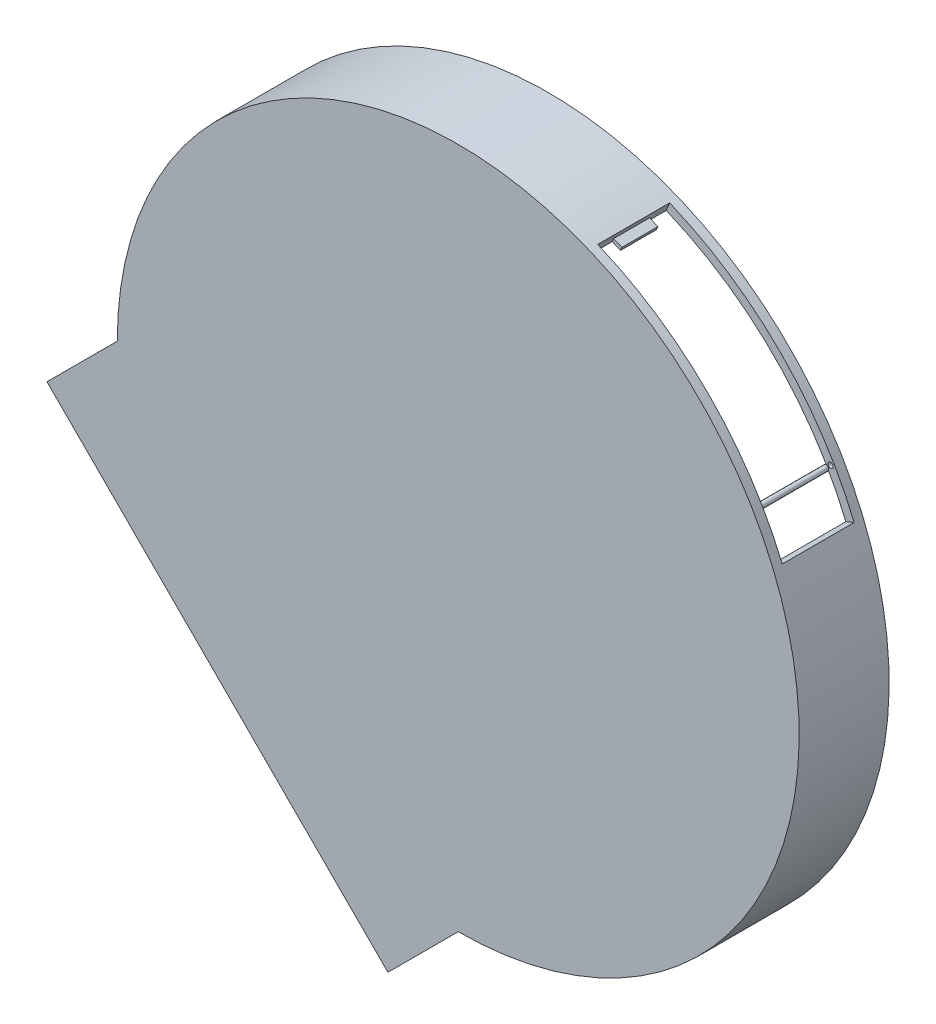
ISO-10303-21;
HEADER;
FILE_DESCRIPTION(('STEP AP214'),'2;1');
FILE_NAME('part.step','',(''),(''),'','','');
FILE_SCHEMA(('AUTOMOTIVE_DESIGN { 1 0 10303 214 1 1 1 1 }'));
ENDSEC;
DATA;
#1=APPLICATION_CONTEXT('core data for automotive mechanical design processes');
#2=APPLICATION_PROTOCOL_DEFINITION('international standard','automotive_design',2000,#1);
#3=PRODUCT_CONTEXT('',#1,'mechanical');
#4=PRODUCT('Part','Part','',(#3));
#5=PRODUCT_RELATED_PRODUCT_CATEGORY('part','',(#4));
#6=PRODUCT_DEFINITION_FORMATION('','',#4);
#7=PRODUCT_DEFINITION_CONTEXT('part definition',#1,'design');
#8=PRODUCT_DEFINITION('design','',#6,#7);
#9=PRODUCT_DEFINITION_SHAPE('','',#8);
#10=(LENGTH_UNIT() NAMED_UNIT(*) SI_UNIT(.MILLI.,.METRE.));
#11=(NAMED_UNIT(*) PLANE_ANGLE_UNIT() SI_UNIT($,.RADIAN.));
#12=(NAMED_UNIT(*) SI_UNIT($,.STERADIAN.) SOLID_ANGLE_UNIT());
#13=UNCERTAINTY_MEASURE_WITH_UNIT(LENGTH_MEASURE(1.E-05),#10,'distance_accuracy_value','');
#14=(GEOMETRIC_REPRESENTATION_CONTEXT(3) GLOBAL_UNCERTAINTY_ASSIGNED_CONTEXT((#13)) GLOBAL_UNIT_ASSIGNED_CONTEXT((#10,
#11,#12)) REPRESENTATION_CONTEXT('',''));
#15=CARTESIAN_POINT('',(0.,0.,0.));
#16=DIRECTION('',(0.,0.,1.));
#17=DIRECTION('',(1.,0.,0.));
#18=AXIS2_PLACEMENT_3D('',#15,#16,#17);
#19=CARTESIAN_POINT('',(0.,0.,10.));
#20=DIRECTION('',(0.923879532511282,-0.382683432365102,0.));
#21=DIRECTION('',(0.382683432365102,0.923879532511282,0.));
#22=AXIS2_PLACEMENT_3D('',#19,#20,#21);
#23=PLANE('',#22);
#24=DIRECTION('',(0.,0.,-1.));
#25=VECTOR('',#24,1.);
#26=CARTESIAN_POINT('',(142.740920272183,344.607065626708,0.));
#27=LINE('',#26,#25);
#28=CARTESIAN_POINT('',(142.740920272183,344.607065626708,70.));
#29=VERTEX_POINT('',#28);
#30=CARTESIAN_POINT('',(142.740920272183,344.607065626708,30.));
#31=VERTEX_POINT('',#30);
#32=EDGE_CURVE('E63',#29,#31,#27,.T.);
#33=ORIENTED_EDGE('',*,*,#32,.T.);
#34=DIRECTION('',(0.382683432365102,0.923879532511282,0.));
#35=VECTOR('',#34,1.);
#36=CARTESIAN_POINT('',(0.,0.,30.));
#37=LINE('',#36,#35);
#38=CARTESIAN_POINT('',(141.210186542723,340.911547496663,30.));
#39=VERTEX_POINT('',#38);
#40=EDGE_CURVE('E520',#39,#31,#37,.T.);
#41=ORIENTED_EDGE('',*,*,#40,.F.);
#42=DIRECTION('',(0.,0.,-1.));
#43=VECTOR('',#42,1.);
#44=CARTESIAN_POINT('',(141.210186542723,340.911547496663,100.));
#45=LINE('',#44,#43);
#46=CARTESIAN_POINT('',(141.210186542723,340.911547496663,10.));
#47=VERTEX_POINT('',#46);
#48=EDGE_CURVE('E304',#47,#39,#45,.F.);
#49=ORIENTED_EDGE('',*,*,#48,.F.);
#50=DIRECTION('',(0.382683432365102,0.923879532511282,0.));
#51=VECTOR('',#50,1.);
#52=CARTESIAN_POINT('',(0.,0.,10.));
#53=LINE('',#52,#51);
#54=CARTESIAN_POINT('',(145.037020866374,350.150342821776,10.));
#55=VERTEX_POINT('',#54);
#56=EDGE_CURVE('E272',#47,#55,#53,.T.);
#57=ORIENTED_EDGE('',*,*,#56,.T.);
#58=DIRECTION('',(0.,0.,1.));
#59=VECTOR('',#58,1.);
#60=CARTESIAN_POINT('',(145.037020866374,350.150342821776,10.));
#61=LINE('',#60,#59);
#62=CARTESIAN_POINT('',(145.037020866374,350.150342821776,90.));
#63=VERTEX_POINT('',#62);
#64=EDGE_CURVE('E296',#55,#63,#61,.T.);
#65=ORIENTED_EDGE('',*,*,#64,.T.);
#66=DIRECTION('',(0.382683432365102,0.923879532511282,0.));
#67=VECTOR('',#66,1.);
#68=CARTESIAN_POINT('',(0.,0.,90.));
#69=LINE('',#68,#67);
#70=CARTESIAN_POINT('',(141.210186542723,340.911547496663,90.));
#71=VERTEX_POINT('',#70);
#72=EDGE_CURVE('E271',#71,#63,#69,.T.);
#73=ORIENTED_EDGE('',*,*,#72,.F.);
#74=CARTESIAN_POINT('',(141.210186542723,340.911547496663,70.));
#75=VERTEX_POINT('',#74);
#76=EDGE_CURVE('E303',#75,#71,#45,.F.);
#77=ORIENTED_EDGE('',*,*,#76,.F.);
#78=DIRECTION('',(0.382683432365102,0.923879532511282,0.));
#79=VECTOR('',#78,1.);
#80=CARTESIAN_POINT('',(0.,0.,70.));
#81=LINE('',#80,#79);
#82=EDGE_CURVE('E68',#75,#29,#81,.T.);
#83=ORIENTED_EDGE('',*,*,#82,.T.);
#84=EDGE_LOOP('',(#33,#41,#49,#57,#65,#73,#77,#83));
#85=FACE_BOUND('',#84,.T.);
#86=ADVANCED_FACE('F47',(#85),#23,.T.);
#87=CARTESIAN_POINT('',(-403.050865276332,24.0508652763321,0.));
#88=DIRECTION('',(0.474460773156863,0.474460773156863,0.741467429811171));
#89=DIRECTION('',(0.,-0.842311826158308,0.538990526367446));
#90=AXIS2_PLACEMENT_3D('',#87,#88,#89);
#91=PLANE('',#90);
#92=DIRECTION('',(-0.707106781186548,0.707106781186547,0.));
#93=VECTOR('',#92,1.);
#94=CARTESIAN_POINT('',(-189.5,-189.5,0.));
#95=LINE('',#94,#93);
#96=CARTESIAN_POINT('',(1.11022302462516E-13,-379.,0.));
#97=VERTEX_POINT('',#96);
#98=CARTESIAN_POINT('',(-379.,0.,0.));
#99=VERTEX_POINT('',#98);
#100=EDGE_CURVE('E56',#97,#99,#95,.T.);
#101=ORIENTED_EDGE('',*,*,#100,.F.);
#102=DIRECTION('',(-0.524296647648439,-0.524296647648439,0.67098886021246));
#103=VECTOR('',#102,1.);
#104=CARTESIAN_POINT('',(1.11022302462516E-13,-379.,0.));
#105=LINE('',#104,#103);
#106=CARTESIAN_POINT('',(-78.1379064150821,-457.137906415082,100.));
#107=VERTEX_POINT('',#106);
#108=EDGE_CURVE('E348',#97,#107,#105,.T.);
#109=ORIENTED_EDGE('',*,*,#108,.T.);
#110=DIRECTION('',(-0.707106781186548,0.707106781186548,0.));
#111=VECTOR('',#110,1.);
#112=CARTESIAN_POINT('',(-267.637906415082,-267.637906415082,100.));
#113=LINE('',#112,#111);
#114=CARTESIAN_POINT('',(-457.137906415082,-78.1379064150823,100.));
#115=VERTEX_POINT('',#114);
#116=EDGE_CURVE('E369',#107,#115,#113,.T.);
#117=ORIENTED_EDGE('',*,*,#116,.T.);
#118=DIRECTION('',(-0.524296647648439,-0.524296647648439,0.670988860212461));
#119=VECTOR('',#118,1.);
#120=CARTESIAN_POINT('',(-309.997557577171,69.0024424228294,-88.3085375442188));
#121=LINE('',#120,#119);
#122=EDGE_CURVE('E356',#99,#115,#121,.T.);
#123=ORIENTED_EDGE('',*,*,#122,.F.);
#124=EDGE_LOOP('',(#101,#109,#117,#123));
#125=FACE_BOUND('',#124,.T.);
#126=DIRECTION('',(-0.707106781186547,0.707106781186548,0.));
#127=VECTOR('',#126,1.);
#128=CARTESIAN_POINT('',(-220.957798858906,-220.957798858906,40.2593316127476));
#129=LINE('',#128,#127);
#130=CARTESIAN_POINT('',(-181.888845651365,-260.026752066448,40.2593316127477));
#131=VERTEX_POINT('',#130);
#132=CARTESIAN_POINT('',(-260.026752066447,-181.888845651365,40.2593316127476));
#133=VERTEX_POINT('',#132);
#134=EDGE_CURVE('E206',#131,#133,#129,.T.);
#135=ORIENTED_EDGE('',*,*,#134,.T.);
#136=DIRECTION('',(0.52429664764844,0.524296647648439,-0.670988860212461));
#137=VECTOR('',#136,1.);
#138=CARTESIAN_POINT('',(-124.386789782827,-46.2488833677458,-133.33114259714));
#139=LINE('',#138,#137);
#140=CARTESIAN_POINT('',(-291.484550925353,-213.346644510272,80.5186632254952));
#141=VERTEX_POINT('',#140);
#142=EDGE_CURVE('E221',#141,#133,#139,.T.);
#143=ORIENTED_EDGE('',*,*,#142,.F.);
#144=DIRECTION('',(-0.707106781186547,0.707106781186548,0.));
#145=VECTOR('',#144,1.);
#146=CARTESIAN_POINT('',(-252.415597717813,-252.415597717812,80.5186632254952));
#147=LINE('',#146,#145);
#148=CARTESIAN_POINT('',(-213.346644510271,-291.484550925354,80.5186632254953));
#149=VERTEX_POINT('',#148);
#150=EDGE_CURVE('E236',#149,#141,#147,.T.);
#151=ORIENTED_EDGE('',*,*,#150,.F.);
#152=DIRECTION('',(0.52429664764844,0.524296647648438,-0.670988860212461));
#153=VECTOR('',#152,1.);
#154=CARTESIAN_POINT('',(-46.2488833677451,-124.386789782828,-133.33114259714));
#155=LINE('',#154,#153);
#156=EDGE_CURVE('E211',#149,#131,#155,.T.);
#157=ORIENTED_EDGE('',*,*,#156,.T.);
#158=EDGE_LOOP('',(#135,#143,#151,#157));
#159=FACE_BOUND('',#158,.T.);
#160=ADVANCED_FACE('F403',(#125,#159),#91,.F.);
#161=CARTESIAN_POINT('',(-398.306257544763,28.7954730079007,7.4146742981117));
#162=DIRECTION('',(0.474460773156863,0.474460773156863,0.741467429811171));
#163=DIRECTION('',(0.,-0.842311826158308,0.538990526367446));
#164=AXIS2_PLACEMENT_3D('',#161,#162,#163);
#165=PLANE('',#164);
#166=DIRECTION('',(-0.707106781186548,0.707106781186547,0.));
#167=VECTOR('',#166,1.);
#168=CARTESIAN_POINT('',(-178.96172100439,-178.96172100439,0.));
#169=LINE('',#168,#167);
#170=CARTESIAN_POINT('',(10.9150875193134,-368.838529528093,0.));
#171=VERTEX_POINT('',#170);
#172=CARTESIAN_POINT('',(-368.838529528093,10.9150875193133,0.));
#173=VERTEX_POINT('',#172);
#174=EDGE_CURVE('E313',#171,#173,#169,.T.);
#175=ORIENTED_EDGE('',*,*,#174,.T.);
#176=CARTESIAN_POINT('',(0.,0.,-229.033166122616));
#177=DIRECTION('',(0.474460773156863,0.474460773156863,0.741467429811171));
#178=DIRECTION('',(0.524296647648439,0.524296647648439,-0.670988860212461));
#179=AXIS2_PLACEMENT_3D('',#176,#177,#178);
#180=ELLIPSE('',#179,497.661778743233,369.);
#181=CARTESIAN_POINT('',(-368.977008299085,-4.11914392281612,9.70893060054728));
#182=VERTEX_POINT('',#181);
#183=EDGE_CURVE('E341',#182,#173,#180,.F.);
#184=ORIENTED_EDGE('',*,*,#183,.F.);
#185=DIRECTION('',(-0.524296647648439,-0.524296647648439,0.670988860212461));
#186=VECTOR('',#185,1.);
#187=CARTESIAN_POINT('',(-298.181882033737,66.6759823425325,-80.8938632461071));
#188=LINE('',#187,#186);
#189=CARTESIAN_POINT('',(-431.714768966098,-66.8569045898292,90.));
#190=VERTEX_POINT('',#189);
#191=EDGE_CURVE('E325',#182,#190,#188,.T.);
#192=ORIENTED_EDGE('',*,*,#191,.T.);
#193=DIRECTION('',(-0.707106781186548,0.707106781186547,0.));
#194=VECTOR('',#193,1.);
#195=CARTESIAN_POINT('',(-249.285836777964,-249.285836777964,90.));
#196=LINE('',#195,#194);
#197=CARTESIAN_POINT('',(-66.8569045898291,-431.714768966098,90.));
#198=VERTEX_POINT('',#197);
#199=EDGE_CURVE('E333',#198,#190,#196,.T.);
#200=ORIENTED_EDGE('',*,*,#199,.F.);
#201=DIRECTION('',(-0.524296647648439,-0.524296647648439,0.670988860212461));
#202=VECTOR('',#201,1.);
#203=CARTESIAN_POINT('',(66.6759823425325,-298.181882033737,-80.893863246107));
#204=LINE('',#203,#202);
#205=CARTESIAN_POINT('',(-4.11914392281601,-368.977008299085,9.70893060054731));
#206=VERTEX_POINT('',#205);
#207=EDGE_CURVE('E308',#206,#198,#204,.T.);
#208=ORIENTED_EDGE('',*,*,#207,.F.);
#209=CARTESIAN_POINT('',(0.,0.,-229.033166122616));
#210=DIRECTION('',(0.474460773156863,0.474460773156863,0.741467429811171));
#211=DIRECTION('',(0.524296647648439,0.524296647648439,-0.670988860212461));
#212=AXIS2_PLACEMENT_3D('',#209,#210,#211);
#213=ELLIPSE('',#212,497.661778743233,369.);
#214=EDGE_CURVE('E345',#206,#171,#213,.T.);
#215=ORIENTED_EDGE('',*,*,#214,.T.);
#216=EDGE_LOOP('',(#175,#184,#192,#200,#208,#215));
#217=FACE_BOUND('',#216,.T.);
#218=DIRECTION('',(0.52429664764844,0.524296647648439,-0.670988860212461));
#219=VECTOR('',#218,1.);
#220=CARTESIAN_POINT('',(-119.642182051259,-41.5042756361771,-125.916468299029));
#221=LINE('',#220,#219);
#222=CARTESIAN_POINT('',(-286.739943193785,-208.602036778703,87.9333375236069));
#223=VERTEX_POINT('',#222);
#224=CARTESIAN_POINT('',(-255.282144334878,-177.144237919797,47.6740059108593));
#225=VERTEX_POINT('',#224);
#226=EDGE_CURVE('E228',#223,#225,#221,.T.);
#227=ORIENTED_EDGE('',*,*,#226,.T.);
#228=DIRECTION('',(-0.707106781186547,0.707106781186548,0.));
#229=VECTOR('',#228,1.);
#230=CARTESIAN_POINT('',(-216.213191127338,-216.213191127337,47.6740059108593));
#231=LINE('',#230,#229);
#232=CARTESIAN_POINT('',(-177.144237919796,-255.282144334879,47.6740059108594));
#233=VERTEX_POINT('',#232);
#234=EDGE_CURVE('E217',#233,#225,#231,.T.);
#235=ORIENTED_EDGE('',*,*,#234,.F.);
#236=DIRECTION('',(0.52429664764844,0.524296647648438,-0.670988860212461));
#237=VECTOR('',#236,1.);
#238=CARTESIAN_POINT('',(-41.5042756361765,-119.642182051259,-125.916468299029));
#239=LINE('',#238,#237);
#240=CARTESIAN_POINT('',(-208.602036778703,-286.739943193785,87.933337523607));
#241=VERTEX_POINT('',#240);
#242=EDGE_CURVE('E220',#241,#233,#239,.T.);
#243=ORIENTED_EDGE('',*,*,#242,.F.);
#244=DIRECTION('',(-0.707106781186547,0.707106781186548,0.));
#245=VECTOR('',#244,1.);
#246=CARTESIAN_POINT('',(-247.670989986244,-247.670989986244,87.9333375236069));
#247=LINE('',#246,#245);
#248=EDGE_CURVE('E224',#241,#223,#247,.T.);
#249=ORIENTED_EDGE('',*,*,#248,.T.);
#250=EDGE_LOOP('',(#227,#235,#243,#249));
#251=FACE_BOUND('',#250,.T.);
#252=ADVANCED_FACE('F423',(#217,#251),#165,.T.);
#253=CARTESIAN_POINT('',(323.893501015378,187.000000000004,95.));
#254=DIRECTION('',(0.,0.,-1.));
#255=DIRECTION('',(-1.,0.,0.));
#256=AXIS2_PLACEMENT_3D('',#253,#254,#255);
#257=CYLINDRICAL_SURFACE('',#256,2.99999999999999);
#258=CARTESIAN_POINT('',(323.893501015378,187.000000000004,90.));
#259=DIRECTION('',(0.,0.,1.));
#260=DIRECTION('',(1.,0.,0.));
#261=AXIS2_PLACEMENT_3D('',#258,#259,#260);
#262=CIRCLE('',#261,2.99999999999999);
#263=CARTESIAN_POINT('',(326.893501015378,187.000000000004,90.));
#264=VERTEX_POINT('',#263);
#265=EDGE_CURVE('E267',#264,#264,#262,.T.);
#266=ORIENTED_EDGE('',*,*,#265,.F.);
#267=EDGE_LOOP('',(#266));
#268=FACE_BOUND('',#267,.T.);
#269=CARTESIAN_POINT('',(323.89350101538,187.,15.));
#270=DIRECTION('',(0.,0.,-1.));
#271=DIRECTION('',(-1.,0.,0.));
#272=AXIS2_PLACEMENT_3D('',#269,#270,#271);
#273=CIRCLE('',#272,2.99999999999999);
#274=CARTESIAN_POINT('',(320.89350101538,187.,15.));
#275=VERTEX_POINT('',#274);
#276=EDGE_CURVE('E256',#275,#275,#273,.T.);
#277=ORIENTED_EDGE('',*,*,#276,.F.);
#278=EDGE_LOOP('',(#277));
#279=FACE_BOUND('',#278,.T.);
#280=ADVANCED_FACE('F444',(#268,#279),#257,.T.);
#281=CARTESIAN_POINT('',(0.,0.,100.));
#282=DIRECTION('',(0.,0.,-1.));
#283=DIRECTION('',(-1.,0.,0.));
#284=AXIS2_PLACEMENT_3D('',#281,#282,#283);
#285=CYLINDRICAL_SURFACE('',#284,379.);
#286=CARTESIAN_POINT('',(0.,0.,0.));
#287=DIRECTION('',(0.,0.,1.));
#288=DIRECTION('',(1.,0.,0.));
#289=AXIS2_PLACEMENT_3D('',#286,#287,#288);
#290=CIRCLE('',#289,379.);
#291=EDGE_CURVE('E360',#97,#99,#290,.T.);
#292=ORIENTED_EDGE('',*,*,#291,.T.);
#293=DIRECTION('',(0.,0.,-1.));
#294=VECTOR('',#293,1.);
#295=CARTESIAN_POINT('',(-379.,0.,100.));
#296=LINE('',#295,#294);
#297=CARTESIAN_POINT('',(-379.,0.,100.));
#298=VERTEX_POINT('',#297);
#299=EDGE_CURVE('E383',#298,#99,#296,.T.);
#300=ORIENTED_EDGE('',*,*,#299,.F.);
#301=CARTESIAN_POINT('',(0.,0.,100.));
#302=DIRECTION('',(0.,0.,1.));
#303=DIRECTION('',(1.,0.,0.));
#304=AXIS2_PLACEMENT_3D('',#301,#302,#303);
#305=CIRCLE('',#304,379.);
#306=CARTESIAN_POINT('',(0.,-379.,100.));
#307=VERTEX_POINT('',#306);
#308=EDGE_CURVE('E361',#307,#298,#305,.T.);
#309=ORIENTED_EDGE('',*,*,#308,.F.);
#310=DIRECTION('',(0.,0.,-1.));
#311=VECTOR('',#310,1.);
#312=CARTESIAN_POINT('',(0.,-379.,100.));
#313=LINE('',#312,#311);
#314=EDGE_CURVE('E376',#307,#97,#313,.T.);
#315=ORIENTED_EDGE('',*,*,#314,.T.);
#316=EDGE_LOOP('',(#292,#300,#309,#315));
#317=FACE_BOUND('',#316,.T.);
#318=CARTESIAN_POINT('',(0.,0.,10.));
#319=DIRECTION('',(0.,0.,-1.));
#320=DIRECTION('',(1.,0.,0.));
#321=AXIS2_PLACEMENT_3D('',#318,#319,#320);
#322=CIRCLE('',#321,379.);
#323=CARTESIAN_POINT('',(350.150342821776,145.037020866374,10.));
#324=VERTEX_POINT('',#323);
#325=EDGE_CURVE('E275',#55,#324,#322,.T.);
#326=ORIENTED_EDGE('',*,*,#325,.T.);
#327=DIRECTION('',(0.,0.,1.));
#328=VECTOR('',#327,1.);
#329=CARTESIAN_POINT('',(350.150342821776,145.037020866374,10.));
#330=LINE('',#329,#328);
#331=CARTESIAN_POINT('',(350.150342821776,145.037020866374,90.));
#332=VERTEX_POINT('',#331);
#333=EDGE_CURVE('E284',#324,#332,#330,.T.);
#334=ORIENTED_EDGE('',*,*,#333,.T.);
#335=CARTESIAN_POINT('',(0.,0.,90.));
#336=DIRECTION('',(0.,0.,-1.));
#337=DIRECTION('',(-1.,0.,0.));
#338=AXIS2_PLACEMENT_3D('',#335,#336,#337);
#339=CIRCLE('',#338,379.);
#340=EDGE_CURVE('E288',#63,#332,#339,.T.);
#341=ORIENTED_EDGE('',*,*,#340,.F.);
#342=ORIENTED_EDGE('',*,*,#64,.F.);
#343=EDGE_LOOP('',(#326,#334,#341,#342));
#344=FACE_BOUND('',#343,.T.);
#345=ADVANCED_FACE('F49',(#317,#344),#285,.T.);
#346=CARTESIAN_POINT('',(0.,0.,100.));
#347=DIRECTION('',(0.,0.,-1.));
#348=DIRECTION('',(-1.,0.,0.));
#349=AXIS2_PLACEMENT_3D('',#346,#347,#348);
#350=CYLINDRICAL_SURFACE('',#349,369.);
#351=CARTESIAN_POINT('',(0.,0.,10.));
#352=DIRECTION('',(0.,0.,1.));
#353=DIRECTION('',(1.,0.,0.));
#354=AXIS2_PLACEMENT_3D('',#351,#352,#353);
#355=CIRCLE('',#354,369.);
#356=CARTESIAN_POINT('',(340.911547496663,141.210186542723,10.));
#357=VERTEX_POINT('',#356);
#358=EDGE_CURVE('E11',#357,#47,#355,.T.);
#359=ORIENTED_EDGE('',*,*,#358,.T.);
#360=ORIENTED_EDGE('',*,*,#48,.T.);
#361=DIRECTION('',(0.,0.,-1.));
#362=VECTOR('',#361,1.);
#363=CARTESIAN_POINT('',(141.210186542723,340.911547496663,0.));
#364=LINE('',#363,#362);
#365=EDGE_CURVE('E204',#75,#39,#364,.T.);
#366=ORIENTED_EDGE('',*,*,#365,.F.);
#367=ORIENTED_EDGE('',*,*,#76,.T.);
#368=CARTESIAN_POINT('',(0.,0.,90.));
#369=DIRECTION('',(0.,0.,1.));
#370=DIRECTION('',(1.,0.,0.));
#371=AXIS2_PLACEMENT_3D('',#368,#369,#370);
#372=CIRCLE('',#371,369.);
#373=CARTESIAN_POINT('',(-368.977008299085,-4.11914392281606,90.));
#374=VERTEX_POINT('',#373);
#375=EDGE_CURVE('E320',#71,#374,#372,.T.);
#376=ORIENTED_EDGE('',*,*,#375,.T.);
#377=DIRECTION('',(0.,0.,-1.));
#378=VECTOR('',#377,1.);
#379=CARTESIAN_POINT('',(-368.977008299085,-4.11914392281601,100.));
#380=LINE('',#379,#378);
#381=EDGE_CURVE('E309',#374,#182,#380,.T.);
#382=ORIENTED_EDGE('',*,*,#381,.T.);
#383=ORIENTED_EDGE('',*,*,#183,.T.);
#384=CARTESIAN_POINT('',(0.,0.,0.));
#385=DIRECTION('',(0.,0.,1.));
#386=DIRECTION('',(1.,0.,0.));
#387=AXIS2_PLACEMENT_3D('',#384,#385,#386);
#388=CIRCLE('',#387,369.);
#389=EDGE_CURVE('E329',#171,#173,#388,.T.);
#390=ORIENTED_EDGE('',*,*,#389,.F.);
#391=ORIENTED_EDGE('',*,*,#214,.F.);
#392=DIRECTION('',(0.,0.,-1.));
#393=VECTOR('',#392,1.);
#394=CARTESIAN_POINT('',(-4.11914392281601,-368.977008299085,100.));
#395=LINE('',#394,#393);
#396=CARTESIAN_POINT('',(-4.11914392281606,-368.977008299085,90.));
#397=VERTEX_POINT('',#396);
#398=EDGE_CURVE('E314',#397,#206,#395,.T.);
#399=ORIENTED_EDGE('',*,*,#398,.F.);
#400=CARTESIAN_POINT('',(340.911547496663,141.210186542723,90.));
#401=VERTEX_POINT('',#400);
#402=EDGE_CURVE('E315',#397,#401,#372,.T.);
#403=ORIENTED_EDGE('',*,*,#402,.T.);
#404=DIRECTION('',(0.,0.,-1.));
#405=VECTOR('',#404,1.);
#406=CARTESIAN_POINT('',(340.911547496663,141.210186542723,100.));
#407=LINE('',#406,#405);
#408=EDGE_CURVE('E299',#401,#357,#407,.T.);
#409=ORIENTED_EDGE('',*,*,#408,.T.);
#410=EDGE_LOOP('',(#359,#360,#366,#367,#376,#382,#383,#390,#391,#399,#403,#409));
#411=FACE_BOUND('',#410,.T.);
#412=ADVANCED_FACE('F428',(#411),#350,.F.);
#413=CARTESIAN_POINT('',(-189.5,189.5,100.));
#414=DIRECTION('',(0.707106781186548,-0.707106781186548,0.));
#415=DIRECTION('',(0.707106781186548,0.707106781186548,0.));
#416=AXIS2_PLACEMENT_3D('',#413,#414,#415);
#417=PLANE('',#416);
#418=ORIENTED_EDGE('',*,*,#299,.T.);
#419=ORIENTED_EDGE('',*,*,#122,.T.);
#420=DIRECTION('',(-0.707106781186548,-0.707106781186548,0.));
#421=VECTOR('',#420,1.);
#422=CARTESIAN_POINT('',(-189.5,189.5,100.));
#423=LINE('',#422,#421);
#424=EDGE_CURVE('E365',#298,#115,#423,.T.);
#425=ORIENTED_EDGE('',*,*,#424,.F.);
#426=EDGE_LOOP('',(#418,#419,#425));
#427=FACE_BOUND('',#426,.T.);
#428=ADVANCED_FACE('F395',(#427),#417,.F.);
#429=CARTESIAN_POINT('',(189.5,-189.5,100.));
#430=DIRECTION('',(0.707106781186548,-0.707106781186548,0.));
#431=DIRECTION('',(0.707106781186548,0.707106781186548,0.));
#432=AXIS2_PLACEMENT_3D('',#429,#430,#431);
#433=PLANE('',#432);
#434=ORIENTED_EDGE('',*,*,#108,.F.);
#435=ORIENTED_EDGE('',*,*,#314,.F.);
#436=DIRECTION('',(-0.707106781186548,-0.707106781186548,0.));
#437=VECTOR('',#436,1.);
#438=CARTESIAN_POINT('',(189.5,-189.5,100.));
#439=LINE('',#438,#437);
#440=EDGE_CURVE('E372',#307,#107,#439,.T.);
#441=ORIENTED_EDGE('',*,*,#440,.T.);
#442=EDGE_LOOP('',(#434,#435,#441));
#443=FACE_BOUND('',#442,.T.);
#444=ADVANCED_FACE('F401',(#443),#433,.T.);
#445=CARTESIAN_POINT('',(0.,0.,100.));
#446=DIRECTION('',(0.,0.,1.));
#447=DIRECTION('',(1.,0.,0.));
#448=AXIS2_PLACEMENT_3D('',#445,#446,#447);
#449=PLANE('',#448);
#450=ORIENTED_EDGE('',*,*,#308,.T.);
#451=ORIENTED_EDGE('',*,*,#424,.T.);
#452=ORIENTED_EDGE('',*,*,#116,.F.);
#453=ORIENTED_EDGE('',*,*,#440,.F.);
#454=EDGE_LOOP('',(#450,#451,#452,#453));
#455=FACE_BOUND('',#454,.T.);
#456=ADVANCED_FACE('F406',(#455),#449,.T.);
#457=CARTESIAN_POINT('',(0.,0.,0.));
#458=DIRECTION('',(0.,0.,1.));
#459=DIRECTION('',(1.,0.,0.));
#460=AXIS2_PLACEMENT_3D('',#457,#458,#459);
#461=PLANE('',#460);
#462=CARTESIAN_POINT('',(323.89350101538,187.,0.));
#463=DIRECTION('',(0.,0.,-1.));
#464=DIRECTION('',(-1.,0.,0.));
#465=AXIS2_PLACEMENT_3D('',#462,#463,#464);
#466=CIRCLE('',#465,2.99999999999999);
#467=CARTESIAN_POINT('',(320.89350101538,187.,0.));
#468=VERTEX_POINT('',#467);
#469=EDGE_CURVE('E246',#468,#468,#466,.T.);
#470=ORIENTED_EDGE('',*,*,#469,.F.);
#471=EDGE_LOOP('',(#470));
#472=FACE_BOUND('',#471,.T.);
#473=ORIENTED_EDGE('',*,*,#174,.F.);
#474=ORIENTED_EDGE('',*,*,#389,.T.);
#475=EDGE_LOOP('',(#473,#474));
#476=FACE_BOUND('',#475,.T.);
#477=ORIENTED_EDGE('',*,*,#291,.F.);
#478=ORIENTED_EDGE('',*,*,#100,.T.);
#479=EDGE_LOOP('',(#477,#478));
#480=FACE_BOUND('',#479,.T.);
#481=ADVANCED_FACE('F390',(#472,#476,#480),#461,.F.);
#482=CARTESIAN_POINT('',(-182.428932188135,182.428932188135,100.));
#483=DIRECTION('',(0.707106781186548,-0.707106781186548,0.));
#484=DIRECTION('',(0.707106781186548,0.707106781186548,0.));
#485=AXIS2_PLACEMENT_3D('',#482,#483,#484);
#486=PLANE('',#485);
#487=ORIENTED_EDGE('',*,*,#381,.F.);
#488=DIRECTION('',(-0.707106781186548,-0.707106781186548,0.));
#489=VECTOR('',#488,1.);
#490=CARTESIAN_POINT('',(-182.428932188135,182.428932188135,90.));
#491=LINE('',#490,#489);
#492=EDGE_CURVE('E319',#374,#190,#491,.T.);
#493=ORIENTED_EDGE('',*,*,#492,.T.);
#494=ORIENTED_EDGE('',*,*,#191,.F.);
#495=EDGE_LOOP('',(#487,#493,#494));
#496=FACE_BOUND('',#495,.T.);
#497=ADVANCED_FACE('F413',(#496),#486,.T.);
#498=CARTESIAN_POINT('',(182.428932188135,-182.428932188135,100.));
#499=DIRECTION('',(0.707106781186548,-0.707106781186548,0.));
#500=DIRECTION('',(0.707106781186548,0.707106781186548,0.));
#501=AXIS2_PLACEMENT_3D('',#498,#499,#500);
#502=PLANE('',#501);
#503=ORIENTED_EDGE('',*,*,#207,.T.);
#504=DIRECTION('',(-0.707106781186548,-0.707106781186548,0.));
#505=VECTOR('',#504,1.);
#506=CARTESIAN_POINT('',(182.428932188135,-182.428932188135,90.));
#507=LINE('',#506,#505);
#508=EDGE_CURVE('E324',#397,#198,#507,.T.);
#509=ORIENTED_EDGE('',*,*,#508,.F.);
#510=ORIENTED_EDGE('',*,*,#398,.T.);
#511=EDGE_LOOP('',(#503,#509,#510));
#512=FACE_BOUND('',#511,.T.);
#513=ADVANCED_FACE('F434',(#512),#502,.F.);
#514=CARTESIAN_POINT('',(0.,0.,90.));
#515=DIRECTION('',(0.,0.,1.));
#516=DIRECTION('',(1.,0.,0.));
#517=AXIS2_PLACEMENT_3D('',#514,#515,#516);
#518=PLANE('',#517);
#519=ORIENTED_EDGE('',*,*,#265,.T.);
#520=EDGE_LOOP('',(#519));
#521=FACE_BOUND('',#520,.T.);
#522=ORIENTED_EDGE('',*,*,#375,.F.);
#523=ORIENTED_EDGE('',*,*,#72,.T.);
#524=ORIENTED_EDGE('',*,*,#340,.T.);
#525=DIRECTION('',(-0.923879532511282,-0.382683432365102,0.));
#526=VECTOR('',#525,1.);
#527=CARTESIAN_POINT('',(350.150342821776,145.037020866374,90.));
#528=LINE('',#527,#526);
#529=EDGE_CURVE('E276',#332,#401,#528,.T.);
#530=ORIENTED_EDGE('',*,*,#529,.T.);
#531=ORIENTED_EDGE('',*,*,#402,.F.);
#532=ORIENTED_EDGE('',*,*,#508,.T.);
#533=ORIENTED_EDGE('',*,*,#199,.T.);
#534=ORIENTED_EDGE('',*,*,#492,.F.);
#535=EDGE_LOOP('',(#522,#523,#524,#530,#531,#532,#533,#534));
#536=FACE_BOUND('',#535,.T.);
#537=ADVANCED_FACE('F438',(#521,#536),#518,.F.);
#538=CARTESIAN_POINT('',(350.150342821776,145.037020866374,10.));
#539=DIRECTION('',(-0.382683432365102,0.923879532511282,0.));
#540=DIRECTION('',(-0.923879532511282,-0.382683432365102,0.));
#541=AXIS2_PLACEMENT_3D('',#538,#539,#540);
#542=PLANE('',#541);
#543=ORIENTED_EDGE('',*,*,#529,.F.);
#544=ORIENTED_EDGE('',*,*,#333,.F.);
#545=DIRECTION('',(-0.923879532511282,-0.382683432365102,0.));
#546=VECTOR('',#545,1.);
#547=CARTESIAN_POINT('',(350.150342821776,145.037020866374,10.));
#548=LINE('',#547,#546);
#549=EDGE_CURVE('E280',#324,#357,#548,.T.);
#550=ORIENTED_EDGE('',*,*,#549,.T.);
#551=ORIENTED_EDGE('',*,*,#408,.F.);
#552=EDGE_LOOP('',(#543,#544,#550,#551));
#553=FACE_BOUND('',#552,.T.);
#554=ADVANCED_FACE('F426',(#553),#542,.T.);
#555=CARTESIAN_POINT('',(0.,0.,10.));
#556=DIRECTION('',(0.,0.,1.));
#557=DIRECTION('',(1.,0.,0.));
#558=AXIS2_PLACEMENT_3D('',#555,#556,#557);
#559=PLANE('',#558);
#560=CARTESIAN_POINT('',(323.89350101538,187.,10.));
#561=DIRECTION('',(0.,0.,1.));
#562=DIRECTION('',(1.,0.,0.));
#563=AXIS2_PLACEMENT_3D('',#560,#561,#562);
#564=CIRCLE('',#563,2.99999999999999);
#565=CARTESIAN_POINT('',(326.89350101538,187.,10.));
#566=VERTEX_POINT('',#565);
#567=EDGE_CURVE('E260',#566,#566,#564,.T.);
#568=ORIENTED_EDGE('',*,*,#567,.F.);
#569=EDGE_LOOP('',(#568));
#570=FACE_BOUND('',#569,.T.);
#571=ORIENTED_EDGE('',*,*,#549,.F.);
#572=ORIENTED_EDGE('',*,*,#325,.F.);
#573=ORIENTED_EDGE('',*,*,#56,.F.);
#574=ORIENTED_EDGE('',*,*,#358,.F.);
#575=EDGE_LOOP('',(#571,#572,#573,#574));
#576=FACE_BOUND('',#575,.T.);
#577=ADVANCED_FACE('F486',(#570,#576),#559,.T.);
#578=CARTESIAN_POINT('',(0.,0.,15.));
#579=DIRECTION('',(0.,0.,-1.));
#580=DIRECTION('',(-1.,0.,0.));
#581=AXIS2_PLACEMENT_3D('',#578,#579,#580);
#582=PLANE('',#581);
#583=ORIENTED_EDGE('',*,*,#276,.T.);
#584=EDGE_LOOP('',(#583));
#585=FACE_BOUND('',#584,.T.);
#586=ADVANCED_FACE('F483',(#585),#582,.T.);
#587=CARTESIAN_POINT('',(323.89350101538,187.,15.));
#588=DIRECTION('',(0.,0.,-1.));
#589=DIRECTION('',(-1.,0.,0.));
#590=AXIS2_PLACEMENT_3D('',#587,#588,#589);
#591=CYLINDRICAL_SURFACE('',#590,2.99999999999999);
#592=ORIENTED_EDGE('',*,*,#567,.T.);
#593=EDGE_LOOP('',(#592));
#594=FACE_BOUND('',#593,.T.);
#595=ORIENTED_EDGE('',*,*,#469,.T.);
#596=EDGE_LOOP('',(#595));
#597=FACE_BOUND('',#596,.T.);
#598=ADVANCED_FACE('F482',(#594,#597),#591,.F.);
#599=CARTESIAN_POINT('',(-216.213191127338,-216.213191127337,47.6740059108593));
#600=DIRECTION('',(-0.52429664764844,-0.524296647648439,0.670988860212461));
#601=DIRECTION('',(0.787975032526426,0.,0.615707193489713));
#602=AXIS2_PLACEMENT_3D('',#599,#600,#601);
#603=PLANE('',#602);
#604=ORIENTED_EDGE('',*,*,#134,.F.);
#605=DIRECTION('',(-0.474460773156863,-0.474460773156863,-0.741467429811171));
#606=VECTOR('',#605,1.);
#607=CARTESIAN_POINT('',(-177.144237919796,-255.282144334879,47.6740059108594));
#608=LINE('',#607,#606);
#609=EDGE_CURVE('E231',#233,#131,#608,.T.);
#610=ORIENTED_EDGE('',*,*,#609,.F.);
#611=ORIENTED_EDGE('',*,*,#234,.T.);
#612=DIRECTION('',(-0.474460773156863,-0.474460773156863,-0.741467429811171));
#613=VECTOR('',#612,1.);
#614=CARTESIAN_POINT('',(-255.282144334878,-177.144237919797,47.6740059108593));
#615=LINE('',#614,#613);
#616=EDGE_CURVE('E243',#225,#133,#615,.T.);
#617=ORIENTED_EDGE('',*,*,#616,.T.);
#618=EDGE_LOOP('',(#604,#610,#611,#617));
#619=FACE_BOUND('',#618,.T.);
#620=ADVANCED_FACE('F461',(#619),#603,.T.);
#621=CARTESIAN_POINT('',(-119.642182051259,-41.5042756361771,-125.916468299029));
#622=DIRECTION('',(-0.707106781186547,0.707106781186548,0.));
#623=DIRECTION('',(-0.707106781186548,-0.707106781186547,0.));
#624=AXIS2_PLACEMENT_3D('',#621,#622,#623);
#625=PLANE('',#624);
#626=ORIENTED_EDGE('',*,*,#142,.T.);
#627=ORIENTED_EDGE('',*,*,#616,.F.);
#628=ORIENTED_EDGE('',*,*,#226,.F.);
#629=DIRECTION('',(-0.474460773156863,-0.474460773156863,-0.741467429811171));
#630=VECTOR('',#629,1.);
#631=CARTESIAN_POINT('',(-286.739943193785,-208.602036778703,87.9333375236069));
#632=LINE('',#631,#630);
#633=EDGE_CURVE('E247',#223,#141,#632,.T.);
#634=ORIENTED_EDGE('',*,*,#633,.T.);
#635=EDGE_LOOP('',(#626,#627,#628,#634));
#636=FACE_BOUND('',#635,.T.);
#637=ADVANCED_FACE('F458',(#636),#625,.F.);
#638=CARTESIAN_POINT('',(-247.670989986244,-247.670989986244,87.9333375236069));
#639=DIRECTION('',(-0.52429664764844,-0.524296647648439,0.670988860212461));
#640=DIRECTION('',(0.787975032526426,0.,0.615707193489712));
#641=AXIS2_PLACEMENT_3D('',#638,#639,#640);
#642=PLANE('',#641);
#643=ORIENTED_EDGE('',*,*,#150,.T.);
#644=ORIENTED_EDGE('',*,*,#633,.F.);
#645=ORIENTED_EDGE('',*,*,#248,.F.);
#646=DIRECTION('',(-0.474460773156863,-0.474460773156863,-0.741467429811171));
#647=VECTOR('',#646,1.);
#648=CARTESIAN_POINT('',(-208.602036778703,-286.739943193785,87.933337523607));
#649=LINE('',#648,#647);
#650=EDGE_CURVE('E250',#241,#149,#649,.T.);
#651=ORIENTED_EDGE('',*,*,#650,.T.);
#652=EDGE_LOOP('',(#643,#644,#645,#651));
#653=FACE_BOUND('',#652,.T.);
#654=ADVANCED_FACE('F469',(#653),#642,.F.);
#655=CARTESIAN_POINT('',(-41.5042756361765,-119.642182051259,-125.916468299029));
#656=DIRECTION('',(-0.707106781186547,0.707106781186548,0.));
#657=DIRECTION('',(-0.707106781186548,-0.707106781186547,0.));
#658=AXIS2_PLACEMENT_3D('',#655,#656,#657);
#659=PLANE('',#658);
#660=ORIENTED_EDGE('',*,*,#156,.F.);
#661=ORIENTED_EDGE('',*,*,#650,.F.);
#662=ORIENTED_EDGE('',*,*,#242,.T.);
#663=ORIENTED_EDGE('',*,*,#609,.T.);
#664=EDGE_LOOP('',(#660,#661,#662,#663));
#665=FACE_BOUND('',#664,.T.);
#666=ADVANCED_FACE('F465',(#665),#659,.T.);
#667=CARTESIAN_POINT('',(150.448981867836,337.084713173012,0.));
#668=DIRECTION('',(0.382683432365102,0.923879532511282,0.));
#669=DIRECTION('',(-0.923879532511282,0.382683432365102,0.));
#670=AXIS2_PLACEMENT_3D('',#667,#668,#669);
#671=PLANE('',#670);
#672=ORIENTED_EDGE('',*,*,#365,.T.);
#673=DIRECTION('',(-0.923879532511282,0.382683432365102,0.));
#674=VECTOR('',#673,1.);
#675=CARTESIAN_POINT('',(150.448981867836,337.084713173012,30.));
#676=LINE('',#675,#674);
#677=CARTESIAN_POINT('',(150.448981867836,337.084713173012,30.));
#678=VERTEX_POINT('',#677);
#679=EDGE_CURVE('E184',#678,#39,#676,.T.);
#680=ORIENTED_EDGE('',*,*,#679,.F.);
#681=DIRECTION('',(0.,0.,-1.));
#682=VECTOR('',#681,1.);
#683=CARTESIAN_POINT('',(150.448981867836,337.084713173012,0.));
#684=LINE('',#683,#682);
#685=CARTESIAN_POINT('',(150.448981867836,337.084713173012,70.));
#686=VERTEX_POINT('',#685);
#687=EDGE_CURVE('E192',#686,#678,#684,.T.);
#688=ORIENTED_EDGE('',*,*,#687,.F.);
#689=DIRECTION('',(-0.923879532511282,0.382683432365102,0.));
#690=VECTOR('',#689,1.);
#691=CARTESIAN_POINT('',(150.448981867836,337.084713173012,70.));
#692=LINE('',#691,#690);
#693=EDGE_CURVE('E512',#686,#75,#692,.T.);
#694=ORIENTED_EDGE('',*,*,#693,.T.);
#695=EDGE_LOOP('',(#672,#680,#688,#694));
#696=FACE_BOUND('',#695,.T.);
#697=ADVANCED_FACE('F203',(#696),#671,.F.);
#698=CARTESIAN_POINT('',(9.23879532511286,-3.82683432365104,30.));
#699=DIRECTION('',(0.,0.,1.));
#700=DIRECTION('',(1.,0.,0.));
#701=AXIS2_PLACEMENT_3D('',#698,#699,#700);
#702=PLANE('',#701);
#703=ORIENTED_EDGE('',*,*,#40,.T.);
#704=DIRECTION('',(-0.923879532511282,0.382683432365102,0.));
#705=VECTOR('',#704,1.);
#706=CARTESIAN_POINT('',(151.979715597296,340.780231303057,30.));
#707=LINE('',#706,#705);
#708=CARTESIAN_POINT('',(151.979715597296,340.780231303057,30.));
#709=VERTEX_POINT('',#708);
#710=EDGE_CURVE('E186',#709,#31,#707,.T.);
#711=ORIENTED_EDGE('',*,*,#710,.F.);
#712=DIRECTION('',(0.382683432365102,0.923879532511282,0.));
#713=VECTOR('',#712,1.);
#714=CARTESIAN_POINT('',(9.23879532511286,-3.82683432365104,30.));
#715=LINE('',#714,#713);
#716=EDGE_CURVE('E179',#678,#709,#715,.T.);
#717=ORIENTED_EDGE('',*,*,#716,.F.);
#718=ORIENTED_EDGE('',*,*,#679,.T.);
#719=EDGE_LOOP('',(#703,#711,#717,#718));
#720=FACE_BOUND('',#719,.T.);
#721=ADVANCED_FACE('F182',(#720),#702,.F.);
#722=CARTESIAN_POINT('',(151.979715597296,340.780231303057,0.));
#723=DIRECTION('',(0.382683432365102,0.923879532511282,0.));
#724=DIRECTION('',(-0.923879532511282,0.382683432365102,0.));
#725=AXIS2_PLACEMENT_3D('',#722,#723,#724);
#726=PLANE('',#725);
#727=ORIENTED_EDGE('',*,*,#32,.F.);
#728=DIRECTION('',(-0.923879532511282,0.382683432365102,0.));
#729=VECTOR('',#728,1.);
#730=CARTESIAN_POINT('',(151.979715597296,340.780231303057,70.));
#731=LINE('',#730,#729);
#732=CARTESIAN_POINT('',(151.979715597296,340.780231303057,70.));
#733=VERTEX_POINT('',#732);
#734=EDGE_CURVE('E213',#733,#29,#731,.T.);
#735=ORIENTED_EDGE('',*,*,#734,.F.);
#736=DIRECTION('',(0.,0.,-1.));
#737=VECTOR('',#736,1.);
#738=CARTESIAN_POINT('',(151.979715597296,340.780231303057,0.));
#739=LINE('',#738,#737);
#740=EDGE_CURVE('E191',#733,#709,#739,.T.);
#741=ORIENTED_EDGE('',*,*,#740,.T.);
#742=ORIENTED_EDGE('',*,*,#710,.T.);
#743=EDGE_LOOP('',(#727,#735,#741,#742));
#744=FACE_BOUND('',#743,.T.);
#745=ADVANCED_FACE('F539',(#744),#726,.T.);
#746=CARTESIAN_POINT('',(9.23879532511285,-3.82683432365104,70.));
#747=DIRECTION('',(0.,0.,1.));
#748=DIRECTION('',(1.,0.,0.));
#749=AXIS2_PLACEMENT_3D('',#746,#747,#748);
#750=PLANE('',#749);
#751=ORIENTED_EDGE('',*,*,#82,.F.);
#752=ORIENTED_EDGE('',*,*,#693,.F.);
#753=DIRECTION('',(0.382683432365102,0.923879532511282,0.));
#754=VECTOR('',#753,1.);
#755=CARTESIAN_POINT('',(9.23879532511285,-3.82683432365104,70.));
#756=LINE('',#755,#754);
#757=EDGE_CURVE('E198',#686,#733,#756,.T.);
#758=ORIENTED_EDGE('',*,*,#757,.T.);
#759=ORIENTED_EDGE('',*,*,#734,.T.);
#760=EDGE_LOOP('',(#751,#752,#758,#759));
#761=FACE_BOUND('',#760,.T.);
#762=ADVANCED_FACE('F516',(#761),#750,.T.);
#763=CARTESIAN_POINT('',(9.23879532511286,-3.82683432365104,0.));
#764=DIRECTION('',(0.923879532511282,-0.382683432365102,0.));
#765=DIRECTION('',(0.382683432365102,0.923879532511282,0.));
#766=AXIS2_PLACEMENT_3D('',#763,#764,#765);
#767=PLANE('',#766);
#768=ORIENTED_EDGE('',*,*,#687,.T.);
#769=ORIENTED_EDGE('',*,*,#716,.T.);
#770=ORIENTED_EDGE('',*,*,#740,.F.);
#771=ORIENTED_EDGE('',*,*,#757,.F.);
#772=EDGE_LOOP('',(#768,#769,#770,#771));
#773=FACE_BOUND('',#772,.T.);
#774=ADVANCED_FACE('F196',(#773),#767,.T.);
#775=CLOSED_SHELL('',(#86,#160,#252,#280,#345,#412,#428,#444,#456,#481,#497,#513,#537,#554,#577,
#586,#598,#620,#637,#654,#666,#697,#721,#745,#762,#774));
#776=MANIFOLD_SOLID_BREP('B2',#775);
#777=ADVANCED_BREP_SHAPE_REPRESENTATION('',(#18,#776),#14);
#778=SHAPE_DEFINITION_REPRESENTATION(#9,#777);
ENDSEC;
END-ISO-10303-21;
